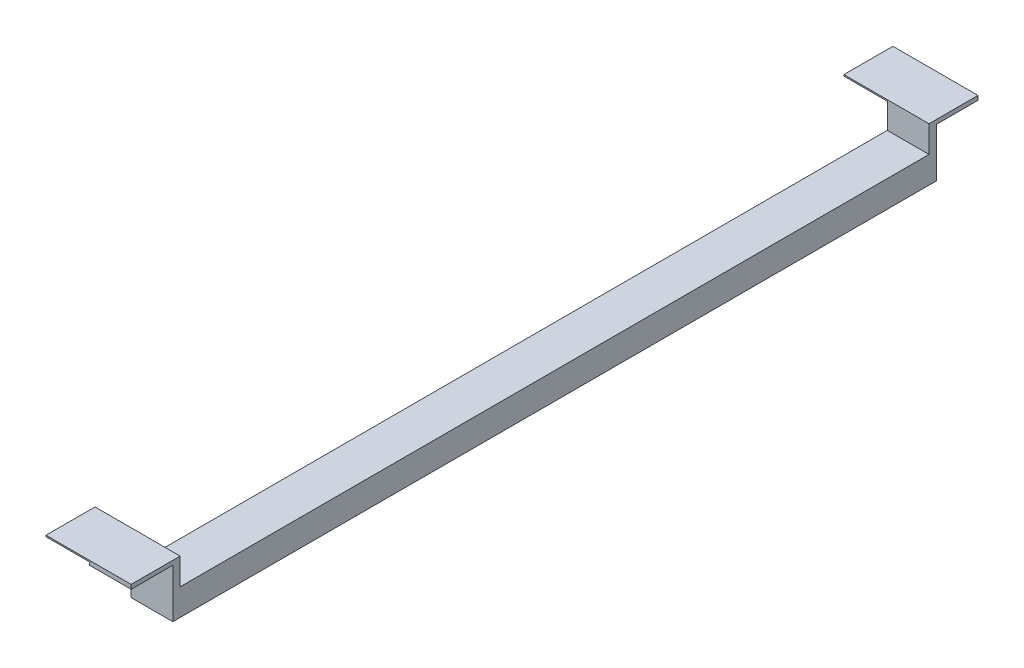
ISO-10303-21;
HEADER;
FILE_DESCRIPTION(('STEP AP214'),'2;1');
FILE_NAME('part.step','',(''),(''),'','','');
FILE_SCHEMA(('AUTOMOTIVE_DESIGN { 1 0 10303 214 1 1 1 1 }'));
ENDSEC;
DATA;
#1=APPLICATION_CONTEXT('core data for automotive mechanical design processes');
#2=APPLICATION_PROTOCOL_DEFINITION('international standard','automotive_design',2000,#1);
#3=PRODUCT_CONTEXT('',#1,'mechanical');
#4=PRODUCT('Part','Part','',(#3));
#5=PRODUCT_RELATED_PRODUCT_CATEGORY('part','',(#4));
#6=PRODUCT_DEFINITION_FORMATION('','',#4);
#7=PRODUCT_DEFINITION_CONTEXT('part definition',#1,'design');
#8=PRODUCT_DEFINITION('design','',#6,#7);
#9=PRODUCT_DEFINITION_SHAPE('','',#8);
#10=(LENGTH_UNIT() NAMED_UNIT(*) SI_UNIT(.MILLI.,.METRE.));
#11=(NAMED_UNIT(*) PLANE_ANGLE_UNIT() SI_UNIT($,.RADIAN.));
#12=(NAMED_UNIT(*) SI_UNIT($,.STERADIAN.) SOLID_ANGLE_UNIT());
#13=UNCERTAINTY_MEASURE_WITH_UNIT(LENGTH_MEASURE(1.E-05),#10,'distance_accuracy_value','');
#14=(GEOMETRIC_REPRESENTATION_CONTEXT(3) GLOBAL_UNCERTAINTY_ASSIGNED_CONTEXT((#13)) GLOBAL_UNIT_ASSIGNED_CONTEXT((#10,
#11,#12)) REPRESENTATION_CONTEXT('',''));
#15=CARTESIAN_POINT('',(0.,0.,0.));
#16=DIRECTION('',(0.,0.,1.));
#17=DIRECTION('',(1.,0.,0.));
#18=AXIS2_PLACEMENT_3D('',#15,#16,#17);
#19=CARTESIAN_POINT('',(-14.4929380145176,10.,-79.7444723086365));
#20=DIRECTION('',(1.,0.,0.));
#21=DIRECTION('',(0.,0.,-1.));
#22=AXIS2_PLACEMENT_3D('',#19,#20,#21);
#23=PLANE('',#22);
#24=DIRECTION('',(0.,0.,1.));
#25=VECTOR('',#24,1.);
#26=CARTESIAN_POINT('',(-14.4929380145173,6.8,1794.65552769136));
#27=LINE('',#26,#25);
#28=CARTESIAN_POINT('',(-14.4929380145173,6.8,1794.65552769136));
#29=VERTEX_POINT('',#28);
#30=CARTESIAN_POINT('',(-14.4929380145173,6.8,1909.75552769136));
#31=VERTEX_POINT('',#30);
#32=EDGE_CURVE('E175',#29,#31,#27,.T.);
#33=ORIENTED_EDGE('',*,*,#32,.F.);
#34=DIRECTION('',(0.,1.,0.));
#35=VECTOR('',#34,1.);
#36=CARTESIAN_POINT('',(-14.4929380145176,10.,1794.65552769136));
#37=LINE('',#36,#35);
#38=CARTESIAN_POINT('',(-14.4929380145176,-52.5,1794.65552769136));
#39=VERTEX_POINT('',#38);
#40=EDGE_CURVE('E180',#39,#29,#37,.T.);
#41=ORIENTED_EDGE('',*,*,#40,.F.);
#42=DIRECTION('',(0.,0.,-1.));
#43=VECTOR('',#42,1.);
#44=CARTESIAN_POINT('',(-14.4929380145176,-52.5,915.005527691364));
#45=LINE('',#44,#43);
#46=CARTESIAN_POINT('',(-14.4929380145176,-52.5,35.3555276913637));
#47=VERTEX_POINT('',#46);
#48=EDGE_CURVE('E275',#39,#47,#45,.T.);
#49=ORIENTED_EDGE('',*,*,#48,.T.);
#50=DIRECTION('',(0.,-1.,0.));
#51=VECTOR('',#50,1.);
#52=CARTESIAN_POINT('',(-14.4929380145176,10.,35.3555276913635));
#53=LINE('',#52,#51);
#54=CARTESIAN_POINT('',(-14.4929380145176,6.8,35.3555276913635));
#55=VERTEX_POINT('',#54);
#56=EDGE_CURVE('E61',#55,#47,#53,.T.);
#57=ORIENTED_EDGE('',*,*,#56,.F.);
#58=DIRECTION('',(0.,0.,1.));
#59=VECTOR('',#58,1.);
#60=CARTESIAN_POINT('',(-14.4929380145176,6.8,-79.7444723086365));
#61=LINE('',#60,#59);
#62=CARTESIAN_POINT('',(-14.4929380145176,6.8,-79.7444723086365));
#63=VERTEX_POINT('',#62);
#64=EDGE_CURVE('E54',#63,#55,#61,.T.);
#65=ORIENTED_EDGE('',*,*,#64,.F.);
#66=DIRECTION('',(0.,-1.,0.));
#67=VECTOR('',#66,1.);
#68=CARTESIAN_POINT('',(-14.4929380145176,10.,-79.7444723086365));
#69=LINE('',#68,#67);
#70=CARTESIAN_POINT('',(-14.4929380145176,0.,-79.7444723086365));
#71=VERTEX_POINT('',#70);
#72=EDGE_CURVE('E47',#63,#71,#69,.T.);
#73=ORIENTED_EDGE('',*,*,#72,.T.);
#74=DIRECTION('',(0.,0.,1.));
#75=VECTOR('',#74,1.);
#76=CARTESIAN_POINT('',(-14.4929380145176,0.,-79.7444723086365));
#77=LINE('',#76,#75);
#78=CARTESIAN_POINT('',(-14.4929380145176,0.,18.2555276913635));
#79=VERTEX_POINT('',#78);
#80=EDGE_CURVE('E299',#71,#79,#77,.T.);
#81=ORIENTED_EDGE('',*,*,#80,.T.);
#82=DIRECTION('',(0.,-1.,0.));
#83=VECTOR('',#82,1.);
#84=CARTESIAN_POINT('',(-14.4929380145176,10.,18.2555276913635));
#85=LINE('',#84,#83);
#86=CARTESIAN_POINT('',(-14.4929380145175,-115.,18.2555276913635));
#87=VERTEX_POINT('',#86);
#88=EDGE_CURVE('E281',#79,#87,#85,.T.);
#89=ORIENTED_EDGE('',*,*,#88,.T.);
#90=DIRECTION('',(0.,0.,-1.));
#91=VECTOR('',#90,1.);
#92=CARTESIAN_POINT('',(-14.4929380145175,-115.,28.2555276913635));
#93=LINE('',#92,#91);
#94=CARTESIAN_POINT('',(-14.4929380145175,-115.,1811.75552769136));
#95=VERTEX_POINT('',#94);
#96=EDGE_CURVE('E295',#95,#87,#93,.T.);
#97=ORIENTED_EDGE('',*,*,#96,.F.);
#98=DIRECTION('',(0.,-1.,0.));
#99=VECTOR('',#98,1.);
#100=CARTESIAN_POINT('',(-14.4929380145176,10.,1811.75552769136));
#101=LINE('',#100,#99);
#102=CARTESIAN_POINT('',(-14.4929380145176,0.,1811.75552769136));
#103=VERTEX_POINT('',#102);
#104=EDGE_CURVE('E234',#103,#95,#101,.T.);
#105=ORIENTED_EDGE('',*,*,#104,.F.);
#106=DIRECTION('',(0.,0.,-1.));
#107=VECTOR('',#106,1.);
#108=CARTESIAN_POINT('',(-14.4929380145176,0.,1909.75552769136));
#109=LINE('',#108,#107);
#110=CARTESIAN_POINT('',(-14.4929380145176,0.,1909.75552769136));
#111=VERTEX_POINT('',#110);
#112=EDGE_CURVE('E246',#111,#103,#109,.T.);
#113=ORIENTED_EDGE('',*,*,#112,.F.);
#114=DIRECTION('',(0.,-1.,0.));
#115=VECTOR('',#114,1.);
#116=CARTESIAN_POINT('',(-14.4929380145176,10.,1909.75552769136));
#117=LINE('',#116,#115);
#118=EDGE_CURVE('E255',#31,#111,#117,.T.);
#119=ORIENTED_EDGE('',*,*,#118,.F.);
#120=EDGE_LOOP('',(#33,#41,#49,#57,#65,#73,#81,#89,#97,#105,#113,#119));
#121=FACE_BOUND('',#120,.T.);
#122=ADVANCED_FACE('F39',(#121),#23,.F.);
#123=CARTESIAN_POINT('',(83.5070619854824,10.,-79.7444723086365));
#124=DIRECTION('',(-1.,0.,0.));
#125=DIRECTION('',(0.,0.,1.));
#126=AXIS2_PLACEMENT_3D('',#123,#124,#125);
#127=PLANE('',#126);
#128=DIRECTION('',(0.,0.,-1.));
#129=VECTOR('',#128,1.);
#130=CARTESIAN_POINT('',(83.5070619854824,-52.5,915.005527691364));
#131=LINE('',#130,#129);
#132=CARTESIAN_POINT('',(83.5070619854824,-52.5,1794.65552769136));
#133=VERTEX_POINT('',#132);
#134=CARTESIAN_POINT('',(83.5070619854824,-52.5,35.3555276913635));
#135=VERTEX_POINT('',#134);
#136=EDGE_CURVE('E278',#133,#135,#131,.T.);
#137=ORIENTED_EDGE('',*,*,#136,.F.);
#138=DIRECTION('',(0.,-1.,0.));
#139=VECTOR('',#138,1.);
#140=CARTESIAN_POINT('',(83.5070619854824,10.,1794.65552769136));
#141=LINE('',#140,#139);
#142=CARTESIAN_POINT('',(83.5070619854824,10.,1794.65552769136));
#143=VERTEX_POINT('',#142);
#144=EDGE_CURVE('E211',#143,#133,#141,.T.);
#145=ORIENTED_EDGE('',*,*,#144,.F.);
#146=DIRECTION('',(0.,0.,1.));
#147=VECTOR('',#146,1.);
#148=CARTESIAN_POINT('',(83.5070619854824,10.,1909.75552769136));
#149=LINE('',#148,#147);
#150=CARTESIAN_POINT('',(83.5070619854824,10.,1909.75552769136));
#151=VERTEX_POINT('',#150);
#152=EDGE_CURVE('E247',#143,#151,#149,.T.);
#153=ORIENTED_EDGE('',*,*,#152,.T.);
#154=DIRECTION('',(0.,-1.,0.));
#155=VECTOR('',#154,1.);
#156=CARTESIAN_POINT('',(83.5070619854824,10.,1909.75552769136));
#157=LINE('',#156,#155);
#158=CARTESIAN_POINT('',(83.5070619854824,0.,1909.75552769136));
#159=VERTEX_POINT('',#158);
#160=EDGE_CURVE('E271',#151,#159,#157,.T.);
#161=ORIENTED_EDGE('',*,*,#160,.T.);
#162=DIRECTION('',(0.,0.,1.));
#163=VECTOR('',#162,1.);
#164=CARTESIAN_POINT('',(83.5070619854824,0.,1909.75552769136));
#165=LINE('',#164,#163);
#166=CARTESIAN_POINT('',(83.5070619854824,0.,1811.75552769136));
#167=VERTEX_POINT('',#166);
#168=EDGE_CURVE('E262',#167,#159,#165,.T.);
#169=ORIENTED_EDGE('',*,*,#168,.F.);
#170=DIRECTION('',(0.,1.,0.));
#171=VECTOR('',#170,1.);
#172=CARTESIAN_POINT('',(83.5070619854824,10.,1811.75552769136));
#173=LINE('',#172,#171);
#174=CARTESIAN_POINT('',(83.5070619854824,-115.,1811.75552769136));
#175=VERTEX_POINT('',#174);
#176=EDGE_CURVE('E242',#175,#167,#173,.T.);
#177=ORIENTED_EDGE('',*,*,#176,.F.);
#178=DIRECTION('',(0.,0.,-1.));
#179=VECTOR('',#178,1.);
#180=CARTESIAN_POINT('',(83.5070619854824,-115.,28.2555276913635));
#181=LINE('',#180,#179);
#182=CARTESIAN_POINT('',(83.5070619854824,-115.,18.2555276913635));
#183=VERTEX_POINT('',#182);
#184=EDGE_CURVE('E291',#175,#183,#181,.T.);
#185=ORIENTED_EDGE('',*,*,#184,.T.);
#186=DIRECTION('',(0.,1.,0.));
#187=VECTOR('',#186,1.);
#188=CARTESIAN_POINT('',(83.5070619854824,10.,18.2555276913635));
#189=LINE('',#188,#187);
#190=CARTESIAN_POINT('',(83.5070619854824,0.,18.2555276913635));
#191=VERTEX_POINT('',#190);
#192=EDGE_CURVE('E287',#183,#191,#189,.T.);
#193=ORIENTED_EDGE('',*,*,#192,.T.);
#194=DIRECTION('',(0.,0.,-1.));
#195=VECTOR('',#194,1.);
#196=CARTESIAN_POINT('',(83.5070619854824,0.,-79.7444723086365));
#197=LINE('',#196,#195);
#198=CARTESIAN_POINT('',(83.5070619854824,0.,-79.7444723086365));
#199=VERTEX_POINT('',#198);
#200=EDGE_CURVE('E314',#191,#199,#197,.T.);
#201=ORIENTED_EDGE('',*,*,#200,.T.);
#202=DIRECTION('',(0.,-1.,0.));
#203=VECTOR('',#202,1.);
#204=CARTESIAN_POINT('',(83.5070619854824,10.,-79.7444723086365));
#205=LINE('',#204,#203);
#206=CARTESIAN_POINT('',(83.5070619854824,10.,-79.7444723086365));
#207=VERTEX_POINT('',#206);
#208=EDGE_CURVE('E11',#207,#199,#205,.T.);
#209=ORIENTED_EDGE('',*,*,#208,.F.);
#210=DIRECTION('',(0.,0.,-1.));
#211=VECTOR('',#210,1.);
#212=CARTESIAN_POINT('',(83.5070619854824,10.,-79.7444723086365));
#213=LINE('',#212,#211);
#214=CARTESIAN_POINT('',(83.5070619854824,10.,35.3555276913635));
#215=VERTEX_POINT('',#214);
#216=EDGE_CURVE('E300',#215,#207,#213,.T.);
#217=ORIENTED_EDGE('',*,*,#216,.F.);
#218=DIRECTION('',(0.,1.,0.));
#219=VECTOR('',#218,1.);
#220=CARTESIAN_POINT('',(83.5070619854824,10.,35.3555276913635));
#221=LINE('',#220,#219);
#222=EDGE_CURVE('E227',#135,#215,#221,.T.);
#223=ORIENTED_EDGE('',*,*,#222,.F.);
#224=EDGE_LOOP('',(#137,#145,#153,#161,#169,#177,#185,#193,#201,#209,#217,#223));
#225=FACE_BOUND('',#224,.T.);
#226=ADVANCED_FACE('F336',(#225),#127,.F.);
#227=CARTESIAN_POINT('',(-14.4929380145176,10.,-79.7444723086365));
#228=DIRECTION('',(0.,0.,1.));
#229=DIRECTION('',(1.,0.,0.));
#230=AXIS2_PLACEMENT_3D('',#227,#228,#229);
#231=PLANE('',#230);
#232=DIRECTION('',(-1.,0.,0.));
#233=VECTOR('',#232,1.);
#234=CARTESIAN_POINT('',(-14.4929380145176,0.,-79.7444723086365));
#235=LINE('',#234,#233);
#236=EDGE_CURVE('E304',#199,#71,#235,.T.);
#237=ORIENTED_EDGE('',*,*,#236,.T.);
#238=ORIENTED_EDGE('',*,*,#72,.F.);
#239=DIRECTION('',(1.,0.,0.));
#240=VECTOR('',#239,1.);
#241=CARTESIAN_POINT('',(-116.492938014518,6.8,-79.7444723086365));
#242=LINE('',#241,#240);
#243=CARTESIAN_POINT('',(-116.492938014518,6.8,-79.7444723086365));
#244=VERTEX_POINT('',#243);
#245=EDGE_CURVE('E207',#244,#63,#242,.T.);
#246=ORIENTED_EDGE('',*,*,#245,.F.);
#247=DIRECTION('',(0.,-1.,0.));
#248=VECTOR('',#247,1.);
#249=CARTESIAN_POINT('',(-116.492938014518,10.,-79.7444723086365));
#250=LINE('',#249,#248);
#251=CARTESIAN_POINT('',(-116.492938014518,10.,-79.7444723086365));
#252=VERTEX_POINT('',#251);
#253=EDGE_CURVE('E185',#252,#244,#250,.T.);
#254=ORIENTED_EDGE('',*,*,#253,.F.);
#255=DIRECTION('',(-1.,0.,0.));
#256=VECTOR('',#255,1.);
#257=CARTESIAN_POINT('',(-14.4929380145176,10.,-79.7444723086365));
#258=LINE('',#257,#256);
#259=EDGE_CURVE('E303',#207,#252,#258,.T.);
#260=ORIENTED_EDGE('',*,*,#259,.F.);
#261=ORIENTED_EDGE('',*,*,#208,.T.);
#262=EDGE_LOOP('',(#237,#238,#246,#254,#260,#261));
#263=FACE_BOUND('',#262,.T.);
#264=ADVANCED_FACE('F325',(#263),#231,.F.);
#265=CARTESIAN_POINT('',(0.,10.,0.));
#266=DIRECTION('',(0.,1.,0.));
#267=DIRECTION('',(0.,0.,1.));
#268=AXIS2_PLACEMENT_3D('',#265,#266,#267);
#269=PLANE('',#268);
#270=ORIENTED_EDGE('',*,*,#259,.T.);
#271=DIRECTION('',(0.,0.,-1.));
#272=VECTOR('',#271,1.);
#273=CARTESIAN_POINT('',(-116.492938014518,10.,-79.7444723086365));
#274=LINE('',#273,#272);
#275=CARTESIAN_POINT('',(-116.492938014518,10.,35.3555276913636));
#276=VERTEX_POINT('',#275);
#277=EDGE_CURVE('E200',#276,#252,#274,.T.);
#278=ORIENTED_EDGE('',*,*,#277,.F.);
#279=DIRECTION('',(-1.,0.,0.));
#280=VECTOR('',#279,1.);
#281=CARTESIAN_POINT('',(-14.4929380145176,10.,35.3555276913635));
#282=LINE('',#281,#280);
#283=EDGE_CURVE('E231',#215,#276,#282,.T.);
#284=ORIENTED_EDGE('',*,*,#283,.F.);
#285=ORIENTED_EDGE('',*,*,#216,.T.);
#286=EDGE_LOOP('',(#270,#278,#284,#285));
#287=FACE_BOUND('',#286,.T.);
#288=ADVANCED_FACE('F366',(#287),#269,.T.);
#289=CARTESIAN_POINT('',(0.,0.,0.));
#290=DIRECTION('',(0.,1.,0.));
#291=DIRECTION('',(0.,0.,1.));
#292=AXIS2_PLACEMENT_3D('',#289,#290,#291);
#293=PLANE('',#292);
#294=ORIENTED_EDGE('',*,*,#80,.F.);
#295=ORIENTED_EDGE('',*,*,#236,.F.);
#296=ORIENTED_EDGE('',*,*,#200,.F.);
#297=DIRECTION('',(1.,0.,0.));
#298=VECTOR('',#297,1.);
#299=CARTESIAN_POINT('',(-14.4929380145176,0.,18.2555276913635));
#300=LINE('',#299,#298);
#301=EDGE_CURVE('E310',#79,#191,#300,.T.);
#302=ORIENTED_EDGE('',*,*,#301,.F.);
#303=EDGE_LOOP('',(#294,#295,#296,#302));
#304=FACE_BOUND('',#303,.T.);
#305=ADVANCED_FACE('F329',(#304),#293,.F.);
#306=CARTESIAN_POINT('',(0.,0.,18.2555276913635));
#307=DIRECTION('',(0.,0.,1.));
#308=DIRECTION('',(1.,0.,0.));
#309=AXIS2_PLACEMENT_3D('',#306,#307,#308);
#310=PLANE('',#309);
#311=ORIENTED_EDGE('',*,*,#88,.F.);
#312=ORIENTED_EDGE('',*,*,#301,.T.);
#313=ORIENTED_EDGE('',*,*,#192,.F.);
#314=DIRECTION('',(1.,0.,0.));
#315=VECTOR('',#314,1.);
#316=CARTESIAN_POINT('',(-14.4929380145175,-115.,18.2555276913635));
#317=LINE('',#316,#315);
#318=EDGE_CURVE('E284',#87,#183,#317,.T.);
#319=ORIENTED_EDGE('',*,*,#318,.F.);
#320=EDGE_LOOP('',(#311,#312,#313,#319));
#321=FACE_BOUND('',#320,.T.);
#322=ADVANCED_FACE('F332',(#321),#310,.F.);
#323=CARTESIAN_POINT('',(-14.4929380145175,-115.,28.2555276913635));
#324=DIRECTION('',(0.,1.,0.));
#325=DIRECTION('',(0.,0.,1.));
#326=AXIS2_PLACEMENT_3D('',#323,#324,#325);
#327=PLANE('',#326);
#328=ORIENTED_EDGE('',*,*,#318,.T.);
#329=ORIENTED_EDGE('',*,*,#184,.F.);
#330=DIRECTION('',(1.,0.,0.));
#331=VECTOR('',#330,1.);
#332=CARTESIAN_POINT('',(-14.4929380145175,-115.,1811.75552769136));
#333=LINE('',#332,#331);
#334=EDGE_CURVE('E238',#95,#175,#333,.T.);
#335=ORIENTED_EDGE('',*,*,#334,.F.);
#336=ORIENTED_EDGE('',*,*,#96,.T.);
#337=EDGE_LOOP('',(#328,#329,#335,#336));
#338=FACE_BOUND('',#337,.T.);
#339=ADVANCED_FACE('F341',(#338),#327,.F.);
#340=CARTESIAN_POINT('',(83.5070619854824,-52.5,915.005527691364));
#341=DIRECTION('',(0.,-1.,0.));
#342=DIRECTION('',(1.,0.,0.));
#343=AXIS2_PLACEMENT_3D('',#340,#341,#342);
#344=PLANE('',#343);
#345=ORIENTED_EDGE('',*,*,#48,.F.);
#346=DIRECTION('',(-1.,0.,0.));
#347=VECTOR('',#346,1.);
#348=CARTESIAN_POINT('',(83.5070619854824,-52.5,1794.65552769136));
#349=LINE('',#348,#347);
#350=EDGE_CURVE('E214',#133,#39,#349,.T.);
#351=ORIENTED_EDGE('',*,*,#350,.F.);
#352=ORIENTED_EDGE('',*,*,#136,.T.);
#353=DIRECTION('',(1.,0.,0.));
#354=VECTOR('',#353,1.);
#355=CARTESIAN_POINT('',(-14.4929380145176,-52.5,35.3555276913635));
#356=LINE('',#355,#354);
#357=EDGE_CURVE('E224',#47,#135,#356,.T.);
#358=ORIENTED_EDGE('',*,*,#357,.F.);
#359=EDGE_LOOP('',(#345,#351,#352,#358));
#360=FACE_BOUND('',#359,.T.);
#361=ADVANCED_FACE('F358',(#360),#344,.F.);
#362=CARTESIAN_POINT('',(-14.4929380145176,10.,1909.75552769136));
#363=DIRECTION('',(0.,0.,-1.));
#364=DIRECTION('',(1.,0.,0.));
#365=AXIS2_PLACEMENT_3D('',#362,#363,#364);
#366=PLANE('',#365);
#367=DIRECTION('',(-1.,0.,0.));
#368=VECTOR('',#367,1.);
#369=CARTESIAN_POINT('',(-14.4929380145176,0.,1909.75552769136));
#370=LINE('',#369,#368);
#371=EDGE_CURVE('E252',#159,#111,#370,.T.);
#372=ORIENTED_EDGE('',*,*,#371,.F.);
#373=ORIENTED_EDGE('',*,*,#160,.F.);
#374=DIRECTION('',(-1.,0.,0.));
#375=VECTOR('',#374,1.);
#376=CARTESIAN_POINT('',(-14.4929380145176,10.,1909.75552769136));
#377=LINE('',#376,#375);
#378=CARTESIAN_POINT('',(-116.492938014517,10.,1909.75552769136));
#379=VERTEX_POINT('',#378);
#380=EDGE_CURVE('E251',#151,#379,#377,.T.);
#381=ORIENTED_EDGE('',*,*,#380,.T.);
#382=DIRECTION('',(0.,1.,0.));
#383=VECTOR('',#382,1.);
#384=CARTESIAN_POINT('',(-116.492938014517,10.,1909.75552769136));
#385=LINE('',#384,#383);
#386=CARTESIAN_POINT('',(-116.492938014517,6.8,1909.75552769136));
#387=VERTEX_POINT('',#386);
#388=EDGE_CURVE('E164',#387,#379,#385,.T.);
#389=ORIENTED_EDGE('',*,*,#388,.F.);
#390=DIRECTION('',(1.,0.,0.));
#391=VECTOR('',#390,1.);
#392=CARTESIAN_POINT('',(-116.492938014517,6.8,1909.75552769136));
#393=LINE('',#392,#391);
#394=EDGE_CURVE('E159',#387,#31,#393,.T.);
#395=ORIENTED_EDGE('',*,*,#394,.T.);
#396=ORIENTED_EDGE('',*,*,#118,.T.);
#397=EDGE_LOOP('',(#372,#373,#381,#389,#395,#396));
#398=FACE_BOUND('',#397,.T.);
#399=ADVANCED_FACE('F351',(#398),#366,.F.);
#400=CARTESIAN_POINT('',(0.,10.,1830.01105538273));
#401=DIRECTION('',(0.,1.,0.));
#402=DIRECTION('',(0.,0.,-1.));
#403=AXIS2_PLACEMENT_3D('',#400,#401,#402);
#404=PLANE('',#403);
#405=DIRECTION('',(1.,0.,0.));
#406=VECTOR('',#405,1.);
#407=CARTESIAN_POINT('',(83.5070619854824,10.,1794.65552769136));
#408=LINE('',#407,#406);
#409=CARTESIAN_POINT('',(-116.492938014517,10.,1794.65552769136));
#410=VERTEX_POINT('',#409);
#411=EDGE_CURVE('E219',#410,#143,#408,.T.);
#412=ORIENTED_EDGE('',*,*,#411,.F.);
#413=DIRECTION('',(0.,0.,-1.));
#414=VECTOR('',#413,1.);
#415=CARTESIAN_POINT('',(-116.492938014517,10.,1794.65552769136));
#416=LINE('',#415,#414);
#417=EDGE_CURVE('E171',#379,#410,#416,.T.);
#418=ORIENTED_EDGE('',*,*,#417,.F.);
#419=ORIENTED_EDGE('',*,*,#380,.F.);
#420=ORIENTED_EDGE('',*,*,#152,.F.);
#421=EDGE_LOOP('',(#412,#418,#419,#420));
#422=FACE_BOUND('',#421,.T.);
#423=ADVANCED_FACE('F354',(#422),#404,.T.);
#424=CARTESIAN_POINT('',(0.,0.,1830.01105538273));
#425=DIRECTION('',(0.,1.,0.));
#426=DIRECTION('',(0.,0.,-1.));
#427=AXIS2_PLACEMENT_3D('',#424,#425,#426);
#428=PLANE('',#427);
#429=ORIENTED_EDGE('',*,*,#112,.T.);
#430=DIRECTION('',(1.,0.,0.));
#431=VECTOR('',#430,1.);
#432=CARTESIAN_POINT('',(-14.4929380145176,0.,1811.75552769136));
#433=LINE('',#432,#431);
#434=EDGE_CURVE('E259',#103,#167,#433,.T.);
#435=ORIENTED_EDGE('',*,*,#434,.T.);
#436=ORIENTED_EDGE('',*,*,#168,.T.);
#437=ORIENTED_EDGE('',*,*,#371,.T.);
#438=EDGE_LOOP('',(#429,#435,#436,#437));
#439=FACE_BOUND('',#438,.T.);
#440=ADVANCED_FACE('F348',(#439),#428,.F.);
#441=CARTESIAN_POINT('',(0.,0.,1811.75552769136));
#442=DIRECTION('',(0.,0.,-1.));
#443=DIRECTION('',(1.,0.,0.));
#444=AXIS2_PLACEMENT_3D('',#441,#442,#443);
#445=PLANE('',#444);
#446=ORIENTED_EDGE('',*,*,#104,.T.);
#447=ORIENTED_EDGE('',*,*,#334,.T.);
#448=ORIENTED_EDGE('',*,*,#176,.T.);
#449=ORIENTED_EDGE('',*,*,#434,.F.);
#450=EDGE_LOOP('',(#446,#447,#448,#449));
#451=FACE_BOUND('',#450,.T.);
#452=ADVANCED_FACE('F343',(#451),#445,.F.);
#453=CARTESIAN_POINT('',(0.,0.,35.3555276913635));
#454=DIRECTION('',(0.,0.,1.));
#455=DIRECTION('',(1.,0.,0.));
#456=AXIS2_PLACEMENT_3D('',#453,#454,#455);
#457=PLANE('',#456);
#458=ORIENTED_EDGE('',*,*,#283,.T.);
#459=DIRECTION('',(0.,1.,0.));
#460=VECTOR('',#459,1.);
#461=CARTESIAN_POINT('',(-116.492938014518,10.,35.3555276913636));
#462=LINE('',#461,#460);
#463=CARTESIAN_POINT('',(-116.492938014518,6.8,35.3555276913635));
#464=VERTEX_POINT('',#463);
#465=EDGE_CURVE('E196',#464,#276,#462,.T.);
#466=ORIENTED_EDGE('',*,*,#465,.F.);
#467=DIRECTION('',(1.,0.,0.));
#468=VECTOR('',#467,1.);
#469=CARTESIAN_POINT('',(-116.492938014518,6.8,35.3555276913635));
#470=LINE('',#469,#468);
#471=EDGE_CURVE('E203',#464,#55,#470,.T.);
#472=ORIENTED_EDGE('',*,*,#471,.T.);
#473=ORIENTED_EDGE('',*,*,#56,.T.);
#474=ORIENTED_EDGE('',*,*,#357,.T.);
#475=ORIENTED_EDGE('',*,*,#222,.T.);
#476=EDGE_LOOP('',(#458,#466,#472,#473,#474,#475));
#477=FACE_BOUND('',#476,.T.);
#478=ADVANCED_FACE('F362',(#477),#457,.T.);
#479=CARTESIAN_POINT('',(0.,0.,1794.65552769136));
#480=DIRECTION('',(0.,0.,-1.));
#481=DIRECTION('',(-1.,0.,0.));
#482=AXIS2_PLACEMENT_3D('',#479,#480,#481);
#483=PLANE('',#482);
#484=ORIENTED_EDGE('',*,*,#144,.T.);
#485=ORIENTED_EDGE('',*,*,#350,.T.);
#486=ORIENTED_EDGE('',*,*,#40,.T.);
#487=DIRECTION('',(1.,0.,0.));
#488=VECTOR('',#487,1.);
#489=CARTESIAN_POINT('',(-116.492938014517,6.8,1794.65552769136));
#490=LINE('',#489,#488);
#491=CARTESIAN_POINT('',(-116.492938014517,6.8,1794.65552769136));
#492=VERTEX_POINT('',#491);
#493=EDGE_CURVE('E156',#492,#29,#490,.T.);
#494=ORIENTED_EDGE('',*,*,#493,.F.);
#495=DIRECTION('',(0.,-1.,0.));
#496=VECTOR('',#495,1.);
#497=CARTESIAN_POINT('',(-116.492938014517,10.,1794.65552769136));
#498=LINE('',#497,#496);
#499=EDGE_CURVE('E165',#410,#492,#498,.T.);
#500=ORIENTED_EDGE('',*,*,#499,.F.);
#501=ORIENTED_EDGE('',*,*,#411,.T.);
#502=EDGE_LOOP('',(#484,#485,#486,#494,#500,#501));
#503=FACE_BOUND('',#502,.T.);
#504=ADVANCED_FACE('F178',(#503),#483,.T.);
#505=CARTESIAN_POINT('',(-116.492938014518,6.8,-79.7444723086365));
#506=DIRECTION('',(0.,1.,0.));
#507=DIRECTION('',(0.,0.,1.));
#508=AXIS2_PLACEMENT_3D('',#505,#506,#507);
#509=PLANE('',#508);
#510=ORIENTED_EDGE('',*,*,#64,.T.);
#511=ORIENTED_EDGE('',*,*,#471,.F.);
#512=DIRECTION('',(0.,0.,1.));
#513=VECTOR('',#512,1.);
#514=CARTESIAN_POINT('',(-116.492938014518,6.8,-79.7444723086365));
#515=LINE('',#514,#513);
#516=EDGE_CURVE('E193',#244,#464,#515,.T.);
#517=ORIENTED_EDGE('',*,*,#516,.F.);
#518=ORIENTED_EDGE('',*,*,#245,.T.);
#519=EDGE_LOOP('',(#510,#511,#517,#518));
#520=FACE_BOUND('',#519,.T.);
#521=ADVANCED_FACE('F371',(#520),#509,.F.);
#522=CARTESIAN_POINT('',(-116.492938014518,0.,0.));
#523=DIRECTION('',(-1.,0.,0.));
#524=DIRECTION('',(0.,0.,1.));
#525=AXIS2_PLACEMENT_3D('',#522,#523,#524);
#526=PLANE('',#525);
#527=ORIENTED_EDGE('',*,*,#253,.T.);
#528=ORIENTED_EDGE('',*,*,#516,.T.);
#529=ORIENTED_EDGE('',*,*,#465,.T.);
#530=ORIENTED_EDGE('',*,*,#277,.T.);
#531=EDGE_LOOP('',(#527,#528,#529,#530));
#532=FACE_BOUND('',#531,.T.);
#533=ADVANCED_FACE('F369',(#532),#526,.T.);
#534=CARTESIAN_POINT('',(-116.492938014517,6.8,1794.65552769136));
#535=DIRECTION('',(0.,1.,0.));
#536=DIRECTION('',(0.,0.,1.));
#537=AXIS2_PLACEMENT_3D('',#534,#535,#536);
#538=PLANE('',#537);
#539=ORIENTED_EDGE('',*,*,#32,.T.);
#540=ORIENTED_EDGE('',*,*,#394,.F.);
#541=DIRECTION('',(0.,0.,1.));
#542=VECTOR('',#541,1.);
#543=CARTESIAN_POINT('',(-116.492938014517,6.8,1794.65552769136));
#544=LINE('',#543,#542);
#545=EDGE_CURVE('E152',#492,#387,#544,.T.);
#546=ORIENTED_EDGE('',*,*,#545,.F.);
#547=ORIENTED_EDGE('',*,*,#493,.T.);
#548=EDGE_LOOP('',(#539,#540,#546,#547));
#549=FACE_BOUND('',#548,.T.);
#550=ADVANCED_FACE('F154',(#549),#538,.F.);
#551=CARTESIAN_POINT('',(-116.492938014518,0.,0.));
#552=DIRECTION('',(-1.,0.,0.));
#553=DIRECTION('',(0.,0.,1.));
#554=AXIS2_PLACEMENT_3D('',#551,#552,#553);
#555=PLANE('',#554);
#556=ORIENTED_EDGE('',*,*,#499,.T.);
#557=ORIENTED_EDGE('',*,*,#545,.T.);
#558=ORIENTED_EDGE('',*,*,#388,.T.);
#559=ORIENTED_EDGE('',*,*,#417,.T.);
#560=EDGE_LOOP('',(#556,#557,#558,#559));
#561=FACE_BOUND('',#560,.T.);
#562=ADVANCED_FACE('F169',(#561),#555,.T.);
#563=CLOSED_SHELL('',(#122,#226,#264,#288,#305,#322,#339,#361,#399,#423,#440,#452,#478,#504,
#521,#533,#550,#562));
#564=MANIFOLD_SOLID_BREP('B2',#563);
#565=ADVANCED_BREP_SHAPE_REPRESENTATION('',(#18,#564),#14);
#566=SHAPE_DEFINITION_REPRESENTATION(#9,#565);
ENDSEC;
END-ISO-10303-21;
